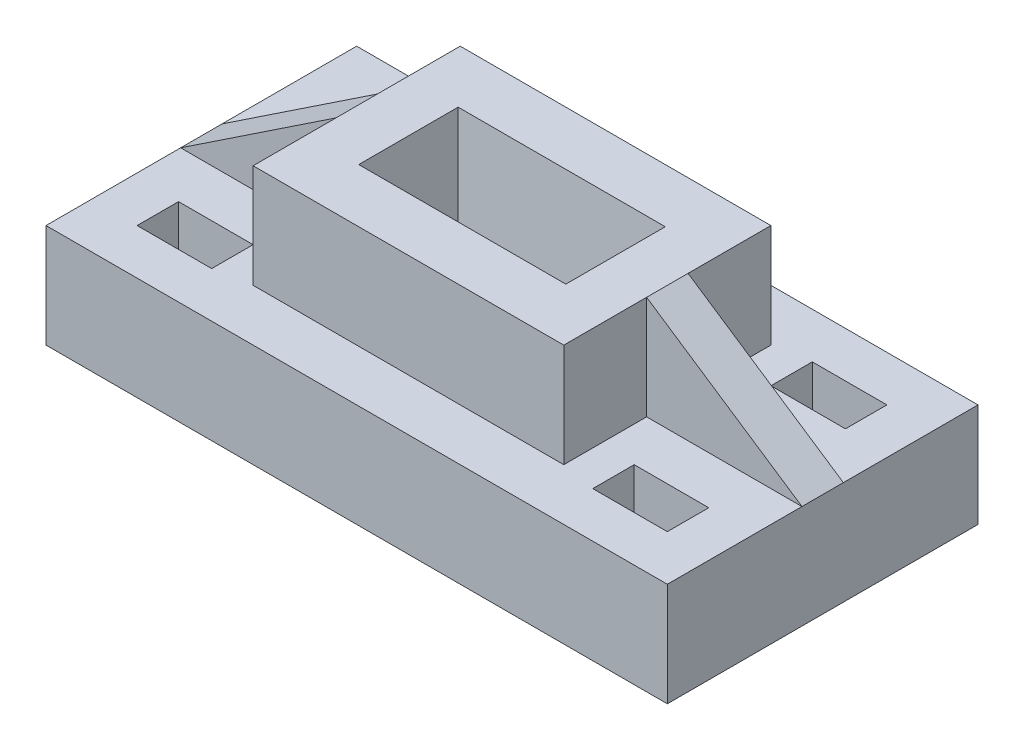
ISO-10303-21;
HEADER;
FILE_DESCRIPTION(('STEP AP214'),'2;1');
FILE_NAME('part.step','',(''),(''),'','','');
FILE_SCHEMA(('AUTOMOTIVE_DESIGN { 1 0 10303 214 1 1 1 1 }'));
ENDSEC;
DATA;
#1=APPLICATION_CONTEXT('core data for automotive mechanical design processes');
#2=APPLICATION_PROTOCOL_DEFINITION('international standard','automotive_design',2000,#1);
#3=PRODUCT_CONTEXT('',#1,'mechanical');
#4=PRODUCT('Part','Part','',(#3));
#5=PRODUCT_RELATED_PRODUCT_CATEGORY('part','',(#4));
#6=PRODUCT_DEFINITION_FORMATION('','',#4);
#7=PRODUCT_DEFINITION_CONTEXT('part definition',#1,'design');
#8=PRODUCT_DEFINITION('design','',#6,#7);
#9=PRODUCT_DEFINITION_SHAPE('','',#8);
#10=(LENGTH_UNIT() NAMED_UNIT(*) SI_UNIT(.MILLI.,.METRE.));
#11=(NAMED_UNIT(*) PLANE_ANGLE_UNIT() SI_UNIT($,.RADIAN.));
#12=(NAMED_UNIT(*) SI_UNIT($,.STERADIAN.) SOLID_ANGLE_UNIT());
#13=UNCERTAINTY_MEASURE_WITH_UNIT(LENGTH_MEASURE(1.E-05),#10,'distance_accuracy_value','');
#14=(GEOMETRIC_REPRESENTATION_CONTEXT(3) GLOBAL_UNCERTAINTY_ASSIGNED_CONTEXT((#13)) GLOBAL_UNIT_ASSIGNED_CONTEXT((#10,
#11,#12)) REPRESENTATION_CONTEXT('',''));
#15=CARTESIAN_POINT('',(0.,0.,0.));
#16=DIRECTION('',(0.,0.,1.));
#17=DIRECTION('',(1.,0.,0.));
#18=AXIS2_PLACEMENT_3D('',#15,#16,#17);
#19=CARTESIAN_POINT('',(0.,12.5,0.));
#20=DIRECTION('',(0.,1.,0.));
#21=DIRECTION('',(0.,0.,1.));
#22=AXIS2_PLACEMENT_3D('',#19,#20,#21);
#23=PLANE('',#22);
#24=DIRECTION('',(0.,0.,1.));
#25=VECTOR('',#24,1.);
#26=CARTESIAN_POINT('',(-64.,12.5,-16.5));
#27=LINE('',#26,#25);
#28=CARTESIAN_POINT('',(-64.,12.5,-26.5));
#29=VERTEX_POINT('',#28);
#30=CARTESIAN_POINT('',(-64.,12.5,-16.5));
#31=VERTEX_POINT('',#30);
#32=EDGE_CURVE('E528',#29,#31,#27,.T.);
#33=ORIENTED_EDGE('',*,*,#32,.F.);
#34=DIRECTION('',(-1.,0.,0.));
#35=VECTOR('',#34,1.);
#36=CARTESIAN_POINT('',(-46.,12.5,-26.5));
#37=LINE('',#36,#35);
#38=CARTESIAN_POINT('',(-46.,12.5,-26.5));
#39=VERTEX_POINT('',#38);
#40=EDGE_CURVE('E543',#39,#29,#37,.T.);
#41=ORIENTED_EDGE('',*,*,#40,.F.);
#42=DIRECTION('',(0.,0.,-1.));
#43=VECTOR('',#42,1.);
#44=CARTESIAN_POINT('',(-46.,12.5,-16.5));
#45=LINE('',#44,#43);
#46=CARTESIAN_POINT('',(-46.,12.5,-16.5));
#47=VERTEX_POINT('',#46);
#48=EDGE_CURVE('E562',#47,#39,#45,.T.);
#49=ORIENTED_EDGE('',*,*,#48,.F.);
#50=DIRECTION('',(1.,0.,0.));
#51=VECTOR('',#50,1.);
#52=CARTESIAN_POINT('',(-46.,12.5,-16.5));
#53=LINE('',#52,#51);
#54=EDGE_CURVE('E558',#31,#47,#53,.T.);
#55=ORIENTED_EDGE('',*,*,#54,.F.);
#56=EDGE_LOOP('',(#33,#41,#49,#55));
#57=FACE_BOUND('',#56,.T.);
#58=DIRECTION('',(1.,0.,0.));
#59=VECTOR('',#58,1.);
#60=CARTESIAN_POINT('',(46.,12.5,-26.5));
#61=LINE('',#60,#59);
#62=CARTESIAN_POINT('',(46.,12.5,-26.5));
#63=VERTEX_POINT('',#62);
#64=CARTESIAN_POINT('',(64.,12.5,-26.5));
#65=VERTEX_POINT('',#64);
#66=EDGE_CURVE('E513',#63,#65,#61,.T.);
#67=ORIENTED_EDGE('',*,*,#66,.T.);
#68=DIRECTION('',(0.,0.,1.));
#69=VECTOR('',#68,1.);
#70=CARTESIAN_POINT('',(64.,12.5,-16.5));
#71=LINE('',#70,#69);
#72=CARTESIAN_POINT('',(64.,12.5,-16.5));
#73=VERTEX_POINT('',#72);
#74=EDGE_CURVE('E368',#65,#73,#71,.T.);
#75=ORIENTED_EDGE('',*,*,#74,.T.);
#76=DIRECTION('',(-1.,0.,0.));
#77=VECTOR('',#76,1.);
#78=CARTESIAN_POINT('',(46.,12.5,-16.5));
#79=LINE('',#78,#77);
#80=CARTESIAN_POINT('',(46.,12.5,-16.5));
#81=VERTEX_POINT('',#80);
#82=EDGE_CURVE('E499',#73,#81,#79,.T.);
#83=ORIENTED_EDGE('',*,*,#82,.T.);
#84=DIRECTION('',(0.,0.,-1.));
#85=VECTOR('',#84,1.);
#86=CARTESIAN_POINT('',(46.,12.5,-16.5));
#87=LINE('',#86,#85);
#88=EDGE_CURVE('E517',#81,#63,#87,.T.);
#89=ORIENTED_EDGE('',*,*,#88,.T.);
#90=EDGE_LOOP('',(#67,#75,#83,#89));
#91=FACE_BOUND('',#90,.T.);
#92=DIRECTION('',(0.,0.,-1.));
#93=VECTOR('',#92,1.);
#94=CARTESIAN_POINT('',(37.5,12.5,-25.));
#95=LINE('',#94,#93);
#96=CARTESIAN_POINT('',(37.5,12.5,-5.));
#97=VERTEX_POINT('',#96);
#98=CARTESIAN_POINT('',(37.5,12.5,-25.));
#99=VERTEX_POINT('',#98);
#100=EDGE_CURVE('E292',#97,#99,#95,.T.);
#101=ORIENTED_EDGE('',*,*,#100,.F.);
#102=DIRECTION('',(1.,0.,0.));
#103=VECTOR('',#102,1.);
#104=CARTESIAN_POINT('',(0.,12.5,-5.));
#105=LINE('',#104,#103);
#106=CARTESIAN_POINT('',(75.,12.5,-5.));
#107=VERTEX_POINT('',#106);
#108=EDGE_CURVE('E281',#97,#107,#105,.T.);
#109=ORIENTED_EDGE('',*,*,#108,.T.);
#110=DIRECTION('',(0.,0.,-1.));
#111=VECTOR('',#110,1.);
#112=CARTESIAN_POINT('',(75.,12.5,-37.5));
#113=LINE('',#112,#111);
#114=CARTESIAN_POINT('',(75.,12.5,-37.5));
#115=VERTEX_POINT('',#114);
#116=EDGE_CURVE('E289',#107,#115,#113,.T.);
#117=ORIENTED_EDGE('',*,*,#116,.T.);
#118=DIRECTION('',(-1.,0.,0.));
#119=VECTOR('',#118,1.);
#120=CARTESIAN_POINT('',(-75.,12.5,-37.5));
#121=LINE('',#120,#119);
#122=CARTESIAN_POINT('',(-75.,12.5,-37.5));
#123=VERTEX_POINT('',#122);
#124=EDGE_CURVE('E303',#115,#123,#121,.T.);
#125=ORIENTED_EDGE('',*,*,#124,.T.);
#126=DIRECTION('',(0.,0.,1.));
#127=VECTOR('',#126,1.);
#128=CARTESIAN_POINT('',(-75.,12.5,-37.5));
#129=LINE('',#128,#127);
#130=CARTESIAN_POINT('',(-75.,12.5,-5.));
#131=VERTEX_POINT('',#130);
#132=EDGE_CURVE('E313',#123,#131,#129,.T.);
#133=ORIENTED_EDGE('',*,*,#132,.T.);
#134=DIRECTION('',(1.,0.,0.));
#135=VECTOR('',#134,1.);
#136=CARTESIAN_POINT('',(0.,12.5,-5.));
#137=LINE('',#136,#135);
#138=CARTESIAN_POINT('',(-37.5,12.5,-5.));
#139=VERTEX_POINT('',#138);
#140=EDGE_CURVE('E371',#131,#139,#137,.T.);
#141=ORIENTED_EDGE('',*,*,#140,.T.);
#142=DIRECTION('',(0.,0.,1.));
#143=VECTOR('',#142,1.);
#144=CARTESIAN_POINT('',(-37.5,12.5,-25.));
#145=LINE('',#144,#143);
#146=CARTESIAN_POINT('',(-37.5,12.5,-25.));
#147=VERTEX_POINT('',#146);
#148=EDGE_CURVE('E458',#147,#139,#145,.T.);
#149=ORIENTED_EDGE('',*,*,#148,.F.);
#150=DIRECTION('',(-1.,0.,0.));
#151=VECTOR('',#150,1.);
#152=CARTESIAN_POINT('',(-37.5,12.5,-25.));
#153=LINE('',#152,#151);
#154=EDGE_CURVE('E453',#99,#147,#153,.T.);
#155=ORIENTED_EDGE('',*,*,#154,.F.);
#156=EDGE_LOOP('',(#101,#109,#117,#125,#133,#141,#149,#155));
#157=FACE_BOUND('',#156,.T.);
#158=ADVANCED_FACE('F45',(#57,#91,#157),#23,.T.);
#159=CARTESIAN_POINT('',(37.5,37.5,-25.));
#160=DIRECTION('',(-1.,0.,0.));
#161=DIRECTION('',(0.,0.,1.));
#162=AXIS2_PLACEMENT_3D('',#159,#160,#161);
#163=PLANE('',#162);
#164=DIRECTION('',(0.,1.,0.));
#165=VECTOR('',#164,1.);
#166=CARTESIAN_POINT('',(37.5,37.5,-5.));
#167=LINE('',#166,#165);
#168=CARTESIAN_POINT('',(37.5,37.5,-5.));
#169=VERTEX_POINT('',#168);
#170=EDGE_CURVE('E283',#97,#169,#167,.T.);
#171=ORIENTED_EDGE('',*,*,#170,.F.);
#172=ORIENTED_EDGE('',*,*,#100,.T.);
#173=DIRECTION('',(0.,-1.,0.));
#174=VECTOR('',#173,1.);
#175=CARTESIAN_POINT('',(37.5,37.5,-25.));
#176=LINE('',#175,#174);
#177=CARTESIAN_POINT('',(37.5,37.5,-25.));
#178=VERTEX_POINT('',#177);
#179=EDGE_CURVE('E308',#178,#99,#176,.T.);
#180=ORIENTED_EDGE('',*,*,#179,.F.);
#181=DIRECTION('',(0.,0.,-1.));
#182=VECTOR('',#181,1.);
#183=CARTESIAN_POINT('',(37.5,37.5,-25.));
#184=LINE('',#183,#182);
#185=EDGE_CURVE('E465',#169,#178,#184,.T.);
#186=ORIENTED_EDGE('',*,*,#185,.F.);
#187=EDGE_LOOP('',(#171,#172,#180,#186));
#188=FACE_BOUND('',#187,.T.);
#189=ADVANCED_FACE('F382',(#188),#163,.F.);
#190=CARTESIAN_POINT('',(-37.5,37.5,-25.));
#191=DIRECTION('',(1.,0.,0.));
#192=DIRECTION('',(0.,0.,-1.));
#193=AXIS2_PLACEMENT_3D('',#190,#191,#192);
#194=PLANE('',#193);
#195=DIRECTION('',(0.,-1.,0.));
#196=VECTOR('',#195,1.);
#197=CARTESIAN_POINT('',(-37.5,37.5,-5.));
#198=LINE('',#197,#196);
#199=CARTESIAN_POINT('',(-37.5,37.5,-5.));
#200=VERTEX_POINT('',#199);
#201=EDGE_CURVE('E481',#200,#139,#198,.T.);
#202=ORIENTED_EDGE('',*,*,#201,.F.);
#203=DIRECTION('',(0.,0.,1.));
#204=VECTOR('',#203,1.);
#205=CARTESIAN_POINT('',(-37.5,37.5,-25.));
#206=LINE('',#205,#204);
#207=CARTESIAN_POINT('',(-37.5,37.5,-25.));
#208=VERTEX_POINT('',#207);
#209=EDGE_CURVE('E437',#208,#200,#206,.T.);
#210=ORIENTED_EDGE('',*,*,#209,.F.);
#211=DIRECTION('',(0.,-1.,0.));
#212=VECTOR('',#211,1.);
#213=CARTESIAN_POINT('',(-37.5,37.5,-25.));
#214=LINE('',#213,#212);
#215=EDGE_CURVE('E470',#208,#147,#214,.T.);
#216=ORIENTED_EDGE('',*,*,#215,.T.);
#217=ORIENTED_EDGE('',*,*,#148,.T.);
#218=EDGE_LOOP('',(#202,#210,#216,#217));
#219=FACE_BOUND('',#218,.T.);
#220=ADVANCED_FACE('F389',(#219),#194,.F.);
#221=DIRECTION('',(1.,0.,0.));
#222=VECTOR('',#221,1.);
#223=CARTESIAN_POINT('',(0.,12.5,5.));
#224=LINE('',#223,#222);
#225=CARTESIAN_POINT('',(37.5,12.5,5.));
#226=VERTEX_POINT('',#225);
#227=CARTESIAN_POINT('',(75.,12.5,5.));
#228=VERTEX_POINT('',#227);
#229=EDGE_CURVE('E294',#226,#228,#224,.T.);
#230=ORIENTED_EDGE('',*,*,#229,.F.);
#231=CARTESIAN_POINT('',(37.5,12.5,25.));
#232=VERTEX_POINT('',#231);
#233=EDGE_CURVE('E450',#232,#226,#95,.T.);
#234=ORIENTED_EDGE('',*,*,#233,.F.);
#235=DIRECTION('',(1.,0.,0.));
#236=VECTOR('',#235,1.);
#237=CARTESIAN_POINT('',(-37.5,12.5,25.));
#238=LINE('',#237,#236);
#239=CARTESIAN_POINT('',(-37.5,12.5,25.));
#240=VERTEX_POINT('',#239);
#241=EDGE_CURVE('E461',#240,#232,#238,.T.);
#242=ORIENTED_EDGE('',*,*,#241,.F.);
#243=CARTESIAN_POINT('',(-37.5,12.5,5.));
#244=VERTEX_POINT('',#243);
#245=EDGE_CURVE('E457',#244,#240,#145,.T.);
#246=ORIENTED_EDGE('',*,*,#245,.F.);
#247=DIRECTION('',(1.,0.,0.));
#248=VECTOR('',#247,1.);
#249=CARTESIAN_POINT('',(0.,12.5,5.));
#250=LINE('',#249,#248);
#251=CARTESIAN_POINT('',(-75.,12.5,5.));
#252=VERTEX_POINT('',#251);
#253=EDGE_CURVE('E363',#252,#244,#250,.T.);
#254=ORIENTED_EDGE('',*,*,#253,.F.);
#255=CARTESIAN_POINT('',(-75.,12.5,37.5));
#256=VERTEX_POINT('',#255);
#257=EDGE_CURVE('E312',#252,#256,#129,.T.);
#258=ORIENTED_EDGE('',*,*,#257,.T.);
#259=DIRECTION('',(1.,0.,0.));
#260=VECTOR('',#259,1.);
#261=CARTESIAN_POINT('',(-75.,12.5,37.5));
#262=LINE('',#261,#260);
#263=CARTESIAN_POINT('',(75.,12.5,37.5));
#264=VERTEX_POINT('',#263);
#265=EDGE_CURVE('E317',#256,#264,#262,.T.);
#266=ORIENTED_EDGE('',*,*,#265,.T.);
#267=EDGE_CURVE('E298',#264,#228,#113,.T.);
#268=ORIENTED_EDGE('',*,*,#267,.T.);
#269=EDGE_LOOP('',(#230,#234,#242,#246,#254,#258,#266,#268));
#270=FACE_BOUND('',#269,.T.);
#271=DIRECTION('',(0.,0.,-1.));
#272=VECTOR('',#271,1.);
#273=CARTESIAN_POINT('',(64.,12.5,16.5));
#274=LINE('',#273,#272);
#275=CARTESIAN_POINT('',(64.,12.5,26.5));
#276=VERTEX_POINT('',#275);
#277=CARTESIAN_POINT('',(64.,12.5,16.5));
#278=VERTEX_POINT('',#277);
#279=EDGE_CURVE('E615',#276,#278,#274,.T.);
#280=ORIENTED_EDGE('',*,*,#279,.F.);
#281=DIRECTION('',(1.,0.,0.));
#282=VECTOR('',#281,1.);
#283=CARTESIAN_POINT('',(46.,12.5,26.5));
#284=LINE('',#283,#282);
#285=CARTESIAN_POINT('',(46.,12.5,26.5));
#286=VERTEX_POINT('',#285);
#287=EDGE_CURVE('E630',#286,#276,#284,.T.);
#288=ORIENTED_EDGE('',*,*,#287,.F.);
#289=DIRECTION('',(0.,0.,1.));
#290=VECTOR('',#289,1.);
#291=CARTESIAN_POINT('',(46.,12.5,16.5));
#292=LINE('',#291,#290);
#293=CARTESIAN_POINT('',(46.,12.5,16.5));
#294=VERTEX_POINT('',#293);
#295=EDGE_CURVE('E649',#294,#286,#292,.T.);
#296=ORIENTED_EDGE('',*,*,#295,.F.);
#297=DIRECTION('',(-1.,0.,0.));
#298=VECTOR('',#297,1.);
#299=CARTESIAN_POINT('',(46.,12.5,16.5));
#300=LINE('',#299,#298);
#301=EDGE_CURVE('E645',#278,#294,#300,.T.);
#302=ORIENTED_EDGE('',*,*,#301,.F.);
#303=EDGE_LOOP('',(#280,#288,#296,#302));
#304=FACE_BOUND('',#303,.T.);
#305=DIRECTION('',(-1.,0.,0.));
#306=VECTOR('',#305,1.);
#307=CARTESIAN_POINT('',(-46.,12.5,26.5));
#308=LINE('',#307,#306);
#309=CARTESIAN_POINT('',(-46.,12.5,26.5));
#310=VERTEX_POINT('',#309);
#311=CARTESIAN_POINT('',(-64.,12.5,26.5));
#312=VERTEX_POINT('',#311);
#313=EDGE_CURVE('E600',#310,#312,#308,.T.);
#314=ORIENTED_EDGE('',*,*,#313,.T.);
#315=DIRECTION('',(0.,0.,-1.));
#316=VECTOR('',#315,1.);
#317=CARTESIAN_POINT('',(-64.,12.5,16.5));
#318=LINE('',#317,#316);
#319=CARTESIAN_POINT('',(-64.,12.5,16.5));
#320=VERTEX_POINT('',#319);
#321=EDGE_CURVE('E572',#312,#320,#318,.T.);
#322=ORIENTED_EDGE('',*,*,#321,.T.);
#323=DIRECTION('',(1.,0.,0.));
#324=VECTOR('',#323,1.);
#325=CARTESIAN_POINT('',(-46.,12.5,16.5));
#326=LINE('',#325,#324);
#327=CARTESIAN_POINT('',(-46.,12.5,16.5));
#328=VERTEX_POINT('',#327);
#329=EDGE_CURVE('E586',#320,#328,#326,.T.);
#330=ORIENTED_EDGE('',*,*,#329,.T.);
#331=DIRECTION('',(0.,0.,1.));
#332=VECTOR('',#331,1.);
#333=CARTESIAN_POINT('',(-46.,12.5,16.5));
#334=LINE('',#333,#332);
#335=EDGE_CURVE('E604',#328,#310,#334,.T.);
#336=ORIENTED_EDGE('',*,*,#335,.T.);
#337=EDGE_LOOP('',(#314,#322,#330,#336));
#338=FACE_BOUND('',#337,.T.);
#339=ADVANCED_FACE('F358',(#270,#304,#338),#23,.T.);
#340=CARTESIAN_POINT('',(0.,-12.5,0.));
#341=DIRECTION('',(0.,1.,0.));
#342=DIRECTION('',(0.,0.,1.));
#343=AXIS2_PLACEMENT_3D('',#340,#341,#342);
#344=PLANE('',#343);
#345=DIRECTION('',(0.,0.,-1.));
#346=VECTOR('',#345,1.);
#347=CARTESIAN_POINT('',(-64.,-12.5,16.5));
#348=LINE('',#347,#346);
#349=CARTESIAN_POINT('',(-64.,-12.5,26.5));
#350=VERTEX_POINT('',#349);
#351=CARTESIAN_POINT('',(-64.,-12.5,16.5));
#352=VERTEX_POINT('',#351);
#353=EDGE_CURVE('E582',#350,#352,#348,.T.);
#354=ORIENTED_EDGE('',*,*,#353,.F.);
#355=DIRECTION('',(-1.,0.,0.));
#356=VECTOR('',#355,1.);
#357=CARTESIAN_POINT('',(-46.,-12.5,26.5));
#358=LINE('',#357,#356);
#359=CARTESIAN_POINT('',(-46.,-12.5,26.5));
#360=VERTEX_POINT('',#359);
#361=EDGE_CURVE('E585',#360,#350,#358,.T.);
#362=ORIENTED_EDGE('',*,*,#361,.F.);
#363=DIRECTION('',(0.,0.,1.));
#364=VECTOR('',#363,1.);
#365=CARTESIAN_POINT('',(-46.,-12.5,16.5));
#366=LINE('',#365,#364);
#367=CARTESIAN_POINT('',(-46.,-12.5,16.5));
#368=VERTEX_POINT('',#367);
#369=EDGE_CURVE('E589',#368,#360,#366,.T.);
#370=ORIENTED_EDGE('',*,*,#369,.F.);
#371=DIRECTION('',(1.,0.,0.));
#372=VECTOR('',#371,1.);
#373=CARTESIAN_POINT('',(-46.,-12.5,16.5));
#374=LINE('',#373,#372);
#375=EDGE_CURVE('E593',#352,#368,#374,.T.);
#376=ORIENTED_EDGE('',*,*,#375,.F.);
#377=EDGE_LOOP('',(#354,#362,#370,#376));
#378=FACE_BOUND('',#377,.T.);
#379=DIRECTION('',(1.,0.,0.));
#380=VECTOR('',#379,1.);
#381=CARTESIAN_POINT('',(46.,-12.5,26.5));
#382=LINE('',#381,#380);
#383=CARTESIAN_POINT('',(46.,-12.5,26.5));
#384=VERTEX_POINT('',#383);
#385=CARTESIAN_POINT('',(64.,-12.5,26.5));
#386=VERTEX_POINT('',#385);
#387=EDGE_CURVE('E638',#384,#386,#382,.T.);
#388=ORIENTED_EDGE('',*,*,#387,.T.);
#389=DIRECTION('',(0.,0.,-1.));
#390=VECTOR('',#389,1.);
#391=CARTESIAN_POINT('',(64.,-12.5,16.5));
#392=LINE('',#391,#390);
#393=CARTESIAN_POINT('',(64.,-12.5,16.5));
#394=VERTEX_POINT('',#393);
#395=EDGE_CURVE('E625',#386,#394,#392,.T.);
#396=ORIENTED_EDGE('',*,*,#395,.T.);
#397=DIRECTION('',(-1.,0.,0.));
#398=VECTOR('',#397,1.);
#399=CARTESIAN_POINT('',(46.,-12.5,16.5));
#400=LINE('',#399,#398);
#401=CARTESIAN_POINT('',(46.,-12.5,16.5));
#402=VERTEX_POINT('',#401);
#403=EDGE_CURVE('E629',#394,#402,#400,.T.);
#404=ORIENTED_EDGE('',*,*,#403,.T.);
#405=DIRECTION('',(0.,0.,1.));
#406=VECTOR('',#405,1.);
#407=CARTESIAN_POINT('',(46.,-12.5,16.5));
#408=LINE('',#407,#406);
#409=EDGE_CURVE('E634',#402,#384,#408,.T.);
#410=ORIENTED_EDGE('',*,*,#409,.T.);
#411=EDGE_LOOP('',(#388,#396,#404,#410));
#412=FACE_BOUND('',#411,.T.);
#413=DIRECTION('',(1.,0.,0.));
#414=VECTOR('',#413,1.);
#415=CARTESIAN_POINT('',(-75.,-12.5,37.5));
#416=LINE('',#415,#414);
#417=CARTESIAN_POINT('',(-75.,-12.5,37.5));
#418=VERTEX_POINT('',#417);
#419=CARTESIAN_POINT('',(75.,-12.5,37.5));
#420=VERTEX_POINT('',#419);
#421=EDGE_CURVE('E299',#418,#420,#416,.T.);
#422=ORIENTED_EDGE('',*,*,#421,.F.);
#423=DIRECTION('',(0.,0.,1.));
#424=VECTOR('',#423,1.);
#425=CARTESIAN_POINT('',(-75.,-12.5,-37.5));
#426=LINE('',#425,#424);
#427=CARTESIAN_POINT('',(-75.,-12.5,-37.5));
#428=VERTEX_POINT('',#427);
#429=EDGE_CURVE('E304',#428,#418,#426,.T.);
#430=ORIENTED_EDGE('',*,*,#429,.F.);
#431=DIRECTION('',(-1.,0.,0.));
#432=VECTOR('',#431,1.);
#433=CARTESIAN_POINT('',(-75.,-12.5,-37.5));
#434=LINE('',#433,#432);
#435=CARTESIAN_POINT('',(75.,-12.5,-37.5));
#436=VERTEX_POINT('',#435);
#437=EDGE_CURVE('E324',#436,#428,#434,.T.);
#438=ORIENTED_EDGE('',*,*,#437,.F.);
#439=DIRECTION('',(0.,0.,-1.));
#440=VECTOR('',#439,1.);
#441=CARTESIAN_POINT('',(75.,-12.5,-37.5));
#442=LINE('',#441,#440);
#443=EDGE_CURVE('E321',#420,#436,#442,.T.);
#444=ORIENTED_EDGE('',*,*,#443,.F.);
#445=EDGE_LOOP('',(#422,#430,#438,#444));
#446=FACE_BOUND('',#445,.T.);
#447=DIRECTION('',(-1.,0.,0.));
#448=VECTOR('',#447,1.);
#449=CARTESIAN_POINT('',(-46.,-12.5,-26.5));
#450=LINE('',#449,#448);
#451=CARTESIAN_POINT('',(-46.,-12.5,-26.5));
#452=VERTEX_POINT('',#451);
#453=CARTESIAN_POINT('',(-64.,-12.5,-26.5));
#454=VERTEX_POINT('',#453);
#455=EDGE_CURVE('E551',#452,#454,#450,.T.);
#456=ORIENTED_EDGE('',*,*,#455,.T.);
#457=DIRECTION('',(0.,0.,1.));
#458=VECTOR('',#457,1.);
#459=CARTESIAN_POINT('',(-64.,-12.5,-16.5));
#460=LINE('',#459,#458);
#461=CARTESIAN_POINT('',(-64.,-12.5,-16.5));
#462=VERTEX_POINT('',#461);
#463=EDGE_CURVE('E538',#454,#462,#460,.T.);
#464=ORIENTED_EDGE('',*,*,#463,.T.);
#465=DIRECTION('',(1.,0.,0.));
#466=VECTOR('',#465,1.);
#467=CARTESIAN_POINT('',(-46.,-12.5,-16.5));
#468=LINE('',#467,#466);
#469=CARTESIAN_POINT('',(-46.,-12.5,-16.5));
#470=VERTEX_POINT('',#469);
#471=EDGE_CURVE('E542',#462,#470,#468,.T.);
#472=ORIENTED_EDGE('',*,*,#471,.T.);
#473=DIRECTION('',(0.,0.,-1.));
#474=VECTOR('',#473,1.);
#475=CARTESIAN_POINT('',(-46.,-12.5,-16.5));
#476=LINE('',#475,#474);
#477=EDGE_CURVE('E547',#470,#452,#476,.T.);
#478=ORIENTED_EDGE('',*,*,#477,.T.);
#479=EDGE_LOOP('',(#456,#464,#472,#478));
#480=FACE_BOUND('',#479,.T.);
#481=DIRECTION('',(0.,0.,1.));
#482=VECTOR('',#481,1.);
#483=CARTESIAN_POINT('',(64.,-12.5,-16.5));
#484=LINE('',#483,#482);
#485=CARTESIAN_POINT('',(64.,-12.5,-26.5));
#486=VERTEX_POINT('',#485);
#487=CARTESIAN_POINT('',(64.,-12.5,-16.5));
#488=VERTEX_POINT('',#487);
#489=EDGE_CURVE('E495',#486,#488,#484,.T.);
#490=ORIENTED_EDGE('',*,*,#489,.F.);
#491=DIRECTION('',(1.,0.,0.));
#492=VECTOR('',#491,1.);
#493=CARTESIAN_POINT('',(46.,-12.5,-26.5));
#494=LINE('',#493,#492);
#495=CARTESIAN_POINT('',(46.,-12.5,-26.5));
#496=VERTEX_POINT('',#495);
#497=EDGE_CURVE('E498',#496,#486,#494,.T.);
#498=ORIENTED_EDGE('',*,*,#497,.F.);
#499=DIRECTION('',(0.,0.,-1.));
#500=VECTOR('',#499,1.);
#501=CARTESIAN_POINT('',(46.,-12.5,-16.5));
#502=LINE('',#501,#500);
#503=CARTESIAN_POINT('',(46.,-12.5,-16.5));
#504=VERTEX_POINT('',#503);
#505=EDGE_CURVE('E502',#504,#496,#502,.T.);
#506=ORIENTED_EDGE('',*,*,#505,.F.);
#507=DIRECTION('',(-1.,0.,0.));
#508=VECTOR('',#507,1.);
#509=CARTESIAN_POINT('',(46.,-12.5,-16.5));
#510=LINE('',#509,#508);
#511=EDGE_CURVE('E506',#488,#504,#510,.T.);
#512=ORIENTED_EDGE('',*,*,#511,.F.);
#513=EDGE_LOOP('',(#490,#498,#506,#512));
#514=FACE_BOUND('',#513,.T.);
#515=ADVANCED_FACE('F349',(#378,#412,#446,#480,#514),#344,.F.);
#516=CARTESIAN_POINT('',(75.,12.5,-37.5));
#517=DIRECTION('',(-1.,0.,0.));
#518=DIRECTION('',(0.,0.,1.));
#519=AXIS2_PLACEMENT_3D('',#516,#517,#518);
#520=PLANE('',#519);
#521=ORIENTED_EDGE('',*,*,#443,.T.);
#522=DIRECTION('',(0.,-1.,0.));
#523=VECTOR('',#522,1.);
#524=CARTESIAN_POINT('',(75.,12.5,-37.5));
#525=LINE('',#524,#523);
#526=EDGE_CURVE('E11',#115,#436,#525,.T.);
#527=ORIENTED_EDGE('',*,*,#526,.F.);
#528=ORIENTED_EDGE('',*,*,#116,.F.);
#529=DIRECTION('',(0.,0.,-1.));
#530=VECTOR('',#529,1.);
#531=CARTESIAN_POINT('',(75.,12.5,-37.5));
#532=LINE('',#531,#530);
#533=EDGE_CURVE('E266',#228,#107,#532,.T.);
#534=ORIENTED_EDGE('',*,*,#533,.F.);
#535=ORIENTED_EDGE('',*,*,#267,.F.);
#536=DIRECTION('',(0.,-1.,0.));
#537=VECTOR('',#536,1.);
#538=CARTESIAN_POINT('',(75.,12.5,37.5));
#539=LINE('',#538,#537);
#540=EDGE_CURVE('E320',#264,#420,#539,.T.);
#541=ORIENTED_EDGE('',*,*,#540,.T.);
#542=EDGE_LOOP('',(#521,#527,#528,#534,#535,#541));
#543=FACE_BOUND('',#542,.T.);
#544=ADVANCED_FACE('F47',(#543),#520,.F.);
#545=CARTESIAN_POINT('',(-75.,12.5,-37.5));
#546=DIRECTION('',(0.,0.,1.));
#547=DIRECTION('',(1.,0.,0.));
#548=AXIS2_PLACEMENT_3D('',#545,#546,#547);
#549=PLANE('',#548);
#550=ORIENTED_EDGE('',*,*,#437,.T.);
#551=DIRECTION('',(0.,-1.,0.));
#552=VECTOR('',#551,1.);
#553=CARTESIAN_POINT('',(-75.,12.5,-37.5));
#554=LINE('',#553,#552);
#555=EDGE_CURVE('E54',#123,#428,#554,.T.);
#556=ORIENTED_EDGE('',*,*,#555,.F.);
#557=ORIENTED_EDGE('',*,*,#124,.F.);
#558=ORIENTED_EDGE('',*,*,#526,.T.);
#559=EDGE_LOOP('',(#550,#556,#557,#558));
#560=FACE_BOUND('',#559,.T.);
#561=ADVANCED_FACE('F373',(#560),#549,.F.);
#562=CARTESIAN_POINT('',(-75.,12.5,-37.5));
#563=DIRECTION('',(1.,0.,0.));
#564=DIRECTION('',(0.,0.,-1.));
#565=AXIS2_PLACEMENT_3D('',#562,#563,#564);
#566=PLANE('',#565);
#567=ORIENTED_EDGE('',*,*,#257,.F.);
#568=DIRECTION('',(0.,0.,-1.));
#569=VECTOR('',#568,1.);
#570=CARTESIAN_POINT('',(-75.,12.5,-37.5));
#571=LINE('',#570,#569);
#572=EDGE_CURVE('E365',#131,#252,#571,.F.);
#573=ORIENTED_EDGE('',*,*,#572,.F.);
#574=ORIENTED_EDGE('',*,*,#132,.F.);
#575=ORIENTED_EDGE('',*,*,#555,.T.);
#576=ORIENTED_EDGE('',*,*,#429,.T.);
#577=DIRECTION('',(0.,-1.,0.));
#578=VECTOR('',#577,1.);
#579=CARTESIAN_POINT('',(-75.,12.5,37.5));
#580=LINE('',#579,#578);
#581=EDGE_CURVE('E332',#256,#418,#580,.T.);
#582=ORIENTED_EDGE('',*,*,#581,.F.);
#583=EDGE_LOOP('',(#567,#573,#574,#575,#576,#582));
#584=FACE_BOUND('',#583,.T.);
#585=ADVANCED_FACE('F342',(#584),#566,.F.);
#586=CARTESIAN_POINT('',(-75.,12.5,37.5));
#587=DIRECTION('',(0.,0.,-1.));
#588=DIRECTION('',(-1.,0.,0.));
#589=AXIS2_PLACEMENT_3D('',#586,#587,#588);
#590=PLANE('',#589);
#591=ORIENTED_EDGE('',*,*,#421,.T.);
#592=ORIENTED_EDGE('',*,*,#540,.F.);
#593=ORIENTED_EDGE('',*,*,#265,.F.);
#594=ORIENTED_EDGE('',*,*,#581,.T.);
#595=EDGE_LOOP('',(#591,#592,#593,#594));
#596=FACE_BOUND('',#595,.T.);
#597=ADVANCED_FACE('F354',(#596),#590,.F.);
#598=ORIENTED_EDGE('',*,*,#233,.T.);
#599=DIRECTION('',(0.,1.,0.));
#600=VECTOR('',#599,1.);
#601=CARTESIAN_POINT('',(37.5,37.5,5.));
#602=LINE('',#601,#600);
#603=CARTESIAN_POINT('',(37.5,37.5,5.));
#604=VERTEX_POINT('',#603);
#605=EDGE_CURVE('E276',#226,#604,#602,.T.);
#606=ORIENTED_EDGE('',*,*,#605,.T.);
#607=CARTESIAN_POINT('',(37.5,37.5,25.));
#608=VERTEX_POINT('',#607);
#609=EDGE_CURVE('E708',#608,#604,#184,.T.);
#610=ORIENTED_EDGE('',*,*,#609,.F.);
#611=DIRECTION('',(0.,-1.,0.));
#612=VECTOR('',#611,1.);
#613=CARTESIAN_POINT('',(37.5,37.5,25.));
#614=LINE('',#613,#612);
#615=EDGE_CURVE('E449',#608,#232,#614,.T.);
#616=ORIENTED_EDGE('',*,*,#615,.T.);
#617=EDGE_LOOP('',(#598,#606,#610,#616));
#618=FACE_BOUND('',#617,.T.);
#619=ADVANCED_FACE('F392',(#618),#163,.F.);
#620=CARTESIAN_POINT('',(-37.5,37.5,-25.));
#621=DIRECTION('',(0.,0.,1.));
#622=DIRECTION('',(1.,0.,0.));
#623=AXIS2_PLACEMENT_3D('',#620,#621,#622);
#624=PLANE('',#623);
#625=ORIENTED_EDGE('',*,*,#154,.T.);
#626=ORIENTED_EDGE('',*,*,#215,.F.);
#627=DIRECTION('',(-1.,0.,0.));
#628=VECTOR('',#627,1.);
#629=CARTESIAN_POINT('',(-37.5,37.5,-25.));
#630=LINE('',#629,#628);
#631=EDGE_CURVE('E435',#178,#208,#630,.T.);
#632=ORIENTED_EDGE('',*,*,#631,.F.);
#633=ORIENTED_EDGE('',*,*,#179,.T.);
#634=EDGE_LOOP('',(#625,#626,#632,#633));
#635=FACE_BOUND('',#634,.T.);
#636=ADVANCED_FACE('F413',(#635),#624,.F.);
#637=CARTESIAN_POINT('',(-37.5,37.5,5.));
#638=VERTEX_POINT('',#637);
#639=CARTESIAN_POINT('',(-37.5,37.5,25.));
#640=VERTEX_POINT('',#639);
#641=EDGE_CURVE('E426',#638,#640,#206,.T.);
#642=ORIENTED_EDGE('',*,*,#641,.F.);
#643=DIRECTION('',(0.,-1.,0.));
#644=VECTOR('',#643,1.);
#645=CARTESIAN_POINT('',(-37.5,37.5,5.));
#646=LINE('',#645,#644);
#647=EDGE_CURVE('E428',#638,#244,#646,.T.);
#648=ORIENTED_EDGE('',*,*,#647,.T.);
#649=ORIENTED_EDGE('',*,*,#245,.T.);
#650=DIRECTION('',(0.,-1.,0.));
#651=VECTOR('',#650,1.);
#652=CARTESIAN_POINT('',(-37.5,37.5,25.));
#653=LINE('',#652,#651);
#654=EDGE_CURVE('E430',#640,#240,#653,.T.);
#655=ORIENTED_EDGE('',*,*,#654,.F.);
#656=EDGE_LOOP('',(#642,#648,#649,#655));
#657=FACE_BOUND('',#656,.T.);
#658=ADVANCED_FACE('F404',(#657),#194,.F.);
#659=CARTESIAN_POINT('',(-37.5,37.5,25.));
#660=DIRECTION('',(0.,0.,-1.));
#661=DIRECTION('',(-1.,0.,0.));
#662=AXIS2_PLACEMENT_3D('',#659,#660,#661);
#663=PLANE('',#662);
#664=ORIENTED_EDGE('',*,*,#241,.T.);
#665=ORIENTED_EDGE('',*,*,#615,.F.);
#666=DIRECTION('',(1.,0.,0.));
#667=VECTOR('',#666,1.);
#668=CARTESIAN_POINT('',(-37.5,37.5,25.));
#669=LINE('',#668,#667);
#670=EDGE_CURVE('E443',#640,#608,#669,.T.);
#671=ORIENTED_EDGE('',*,*,#670,.F.);
#672=ORIENTED_EDGE('',*,*,#654,.T.);
#673=EDGE_LOOP('',(#664,#665,#671,#672));
#674=FACE_BOUND('',#673,.T.);
#675=ADVANCED_FACE('F412',(#674),#663,.F.);
#676=CARTESIAN_POINT('',(0.,37.5,0.));
#677=DIRECTION('',(0.,1.,0.));
#678=DIRECTION('',(0.,0.,1.));
#679=AXIS2_PLACEMENT_3D('',#676,#677,#678);
#680=PLANE('',#679);
#681=DIRECTION('',(1.,0.,0.));
#682=VECTOR('',#681,1.);
#683=CARTESIAN_POINT('',(-25.,37.5,12.));
#684=LINE('',#683,#682);
#685=CARTESIAN_POINT('',(-25.,37.5,12.));
#686=VERTEX_POINT('',#685);
#687=CARTESIAN_POINT('',(25.,37.5,12.));
#688=VERTEX_POINT('',#687);
#689=EDGE_CURVE('E678',#686,#688,#684,.T.);
#690=ORIENTED_EDGE('',*,*,#689,.F.);
#691=DIRECTION('',(0.,0.,1.));
#692=VECTOR('',#691,1.);
#693=CARTESIAN_POINT('',(-25.,37.5,-12.));
#694=LINE('',#693,#692);
#695=CARTESIAN_POINT('',(-25.,37.5,-12.));
#696=VERTEX_POINT('',#695);
#697=EDGE_CURVE('E675',#696,#686,#694,.T.);
#698=ORIENTED_EDGE('',*,*,#697,.F.);
#699=DIRECTION('',(-1.,0.,0.));
#700=VECTOR('',#699,1.);
#701=CARTESIAN_POINT('',(-25.,37.5,-12.));
#702=LINE('',#701,#700);
#703=CARTESIAN_POINT('',(25.,37.5,-12.));
#704=VERTEX_POINT('',#703);
#705=EDGE_CURVE('E671',#704,#696,#702,.T.);
#706=ORIENTED_EDGE('',*,*,#705,.F.);
#707=DIRECTION('',(0.,0.,-1.));
#708=VECTOR('',#707,1.);
#709=CARTESIAN_POINT('',(25.,37.5,-12.));
#710=LINE('',#709,#708);
#711=EDGE_CURVE('E659',#688,#704,#710,.T.);
#712=ORIENTED_EDGE('',*,*,#711,.F.);
#713=EDGE_LOOP('',(#690,#698,#706,#712));
#714=FACE_BOUND('',#713,.T.);
#715=EDGE_CURVE('E434',#200,#638,#206,.T.);
#716=ORIENTED_EDGE('',*,*,#715,.T.);
#717=ORIENTED_EDGE('',*,*,#641,.T.);
#718=ORIENTED_EDGE('',*,*,#670,.T.);
#719=ORIENTED_EDGE('',*,*,#609,.T.);
#720=EDGE_CURVE('E711',#604,#169,#184,.T.);
#721=ORIENTED_EDGE('',*,*,#720,.T.);
#722=ORIENTED_EDGE('',*,*,#185,.T.);
#723=ORIENTED_EDGE('',*,*,#631,.T.);
#724=ORIENTED_EDGE('',*,*,#209,.T.);
#725=EDGE_LOOP('',(#716,#717,#718,#719,#721,#722,#723,#724));
#726=FACE_BOUND('',#725,.T.);
#727=ADVANCED_FACE('F419',(#714,#726),#680,.T.);
#728=CARTESIAN_POINT('',(25.,37.5,-12.));
#729=DIRECTION('',(0.996194698091746,-0.0871557427476584,0.));
#730=DIRECTION('',(0.0871557427476584,0.996194698091746,0.));
#731=AXIS2_PLACEMENT_3D('',#728,#729,#730);
#732=PLANE('',#731);
#733=ORIENTED_EDGE('',*,*,#711,.T.);
#734=DIRECTION('',(0.0868265938642478,0.992432509138967,-0.0868265938642478));
#735=VECTOR('',#734,1.);
#736=CARTESIAN_POINT('',(25.,37.5,-12.));
#737=LINE('',#736,#735);
#738=CARTESIAN_POINT('',(22.8127834118519,12.5,-9.8127834118519));
#739=VERTEX_POINT('',#738);
#740=EDGE_CURVE('E686',#739,#704,#737,.T.);
#741=ORIENTED_EDGE('',*,*,#740,.F.);
#742=DIRECTION('',(0.,0.,-1.));
#743=VECTOR('',#742,1.);
#744=CARTESIAN_POINT('',(22.8127834118519,12.5,0.));
#745=LINE('',#744,#743);
#746=CARTESIAN_POINT('',(22.8127834118519,12.5,9.81278341185189));
#747=VERTEX_POINT('',#746);
#748=EDGE_CURVE('E682',#747,#739,#745,.T.);
#749=ORIENTED_EDGE('',*,*,#748,.F.);
#750=DIRECTION('',(0.0868265938642478,0.992432509138967,0.0868265938642478));
#751=VECTOR('',#750,1.);
#752=CARTESIAN_POINT('',(24.6230571298967,33.1915232795657,11.6230571298966));
#753=LINE('',#752,#751);
#754=EDGE_CURVE('E480',#747,#688,#753,.T.);
#755=ORIENTED_EDGE('',*,*,#754,.T.);
#756=EDGE_LOOP('',(#733,#741,#749,#755));
#757=FACE_BOUND('',#756,.T.);
#758=ADVANCED_FACE('F808',(#757),#732,.F.);
#759=CARTESIAN_POINT('',(-25.,37.5,12.));
#760=DIRECTION('',(0.,-0.0871557427476584,0.996194698091746));
#761=DIRECTION('',(0.,-0.996194698091746,-0.0871557427476584));
#762=AXIS2_PLACEMENT_3D('',#759,#760,#761);
#763=PLANE('',#762);
#764=ORIENTED_EDGE('',*,*,#689,.T.);
#765=ORIENTED_EDGE('',*,*,#754,.F.);
#766=DIRECTION('',(1.,0.,0.));
#767=VECTOR('',#766,1.);
#768=CARTESIAN_POINT('',(0.,12.5,9.81278341185189));
#769=LINE('',#768,#767);
#770=CARTESIAN_POINT('',(-22.8127834118519,12.5,9.81278341185189));
#771=VERTEX_POINT('',#770);
#772=EDGE_CURVE('E691',#771,#747,#769,.T.);
#773=ORIENTED_EDGE('',*,*,#772,.F.);
#774=DIRECTION('',(-0.0868265938642478,0.992432509138967,0.0868265938642478));
#775=VECTOR('',#774,1.);
#776=CARTESIAN_POINT('',(-24.8190674223504,35.4319311741916,11.8190674223504));
#777=LINE('',#776,#775);
#778=EDGE_CURVE('E685',#771,#686,#777,.T.);
#779=ORIENTED_EDGE('',*,*,#778,.T.);
#780=EDGE_LOOP('',(#764,#765,#773,#779));
#781=FACE_BOUND('',#780,.T.);
#782=ADVANCED_FACE('F811',(#781),#763,.F.);
#783=CARTESIAN_POINT('',(-25.,37.5,-12.));
#784=DIRECTION('',(-0.996194698091746,-0.0871557427476584,0.));
#785=DIRECTION('',(0.0871557427476584,-0.996194698091746,0.));
#786=AXIS2_PLACEMENT_3D('',#783,#784,#785);
#787=PLANE('',#786);
#788=ORIENTED_EDGE('',*,*,#778,.F.);
#789=DIRECTION('',(0.,0.,1.));
#790=VECTOR('',#789,1.);
#791=CARTESIAN_POINT('',(-22.8127834118519,12.5,0.));
#792=LINE('',#791,#790);
#793=CARTESIAN_POINT('',(-22.8127834118519,12.5,-9.8127834118519));
#794=VERTEX_POINT('',#793);
#795=EDGE_CURVE('E703',#794,#771,#792,.T.);
#796=ORIENTED_EDGE('',*,*,#795,.F.);
#797=DIRECTION('',(-0.0868265938642478,0.992432509138967,-0.0868265938642478));
#798=VECTOR('',#797,1.);
#799=CARTESIAN_POINT('',(-25.,37.5,-12.));
#800=LINE('',#799,#798);
#801=EDGE_CURVE('E690',#794,#696,#800,.T.);
#802=ORIENTED_EDGE('',*,*,#801,.T.);
#803=ORIENTED_EDGE('',*,*,#697,.T.);
#804=EDGE_LOOP('',(#788,#796,#802,#803));
#805=FACE_BOUND('',#804,.T.);
#806=ADVANCED_FACE('F815',(#805),#787,.F.);
#807=CARTESIAN_POINT('',(-25.,37.5,-12.));
#808=DIRECTION('',(0.,-0.0871557427476584,-0.996194698091746));
#809=DIRECTION('',(0.,0.996194698091746,-0.0871557427476584));
#810=AXIS2_PLACEMENT_3D('',#807,#808,#809);
#811=PLANE('',#810);
#812=ORIENTED_EDGE('',*,*,#705,.T.);
#813=ORIENTED_EDGE('',*,*,#801,.F.);
#814=DIRECTION('',(-1.,0.,0.));
#815=VECTOR('',#814,1.);
#816=CARTESIAN_POINT('',(0.,12.5,-9.8127834118519));
#817=LINE('',#816,#815);
#818=EDGE_CURVE('E699',#739,#794,#817,.T.);
#819=ORIENTED_EDGE('',*,*,#818,.F.);
#820=ORIENTED_EDGE('',*,*,#740,.T.);
#821=EDGE_LOOP('',(#812,#813,#819,#820));
#822=FACE_BOUND('',#821,.T.);
#823=ADVANCED_FACE('F806',(#822),#811,.F.);
#824=CARTESIAN_POINT('',(0.,12.5,0.));
#825=DIRECTION('',(0.,1.,0.));
#826=DIRECTION('',(0.,0.,1.));
#827=AXIS2_PLACEMENT_3D('',#824,#825,#826);
#828=PLANE('',#827);
#829=ORIENTED_EDGE('',*,*,#748,.T.);
#830=ORIENTED_EDGE('',*,*,#818,.T.);
#831=ORIENTED_EDGE('',*,*,#795,.T.);
#832=ORIENTED_EDGE('',*,*,#772,.T.);
#833=EDGE_LOOP('',(#829,#830,#831,#832));
#834=FACE_BOUND('',#833,.T.);
#835=ADVANCED_FACE('F802',(#834),#828,.T.);
#836=CARTESIAN_POINT('',(64.,-12.5,16.5));
#837=DIRECTION('',(1.,0.,0.));
#838=DIRECTION('',(0.,0.,-1.));
#839=AXIS2_PLACEMENT_3D('',#836,#837,#838);
#840=PLANE('',#839);
#841=ORIENTED_EDGE('',*,*,#279,.T.);
#842=DIRECTION('',(0.,1.,0.));
#843=VECTOR('',#842,1.);
#844=CARTESIAN_POINT('',(64.,-12.5,16.5));
#845=LINE('',#844,#843);
#846=EDGE_CURVE('E642',#394,#278,#845,.T.);
#847=ORIENTED_EDGE('',*,*,#846,.F.);
#848=ORIENTED_EDGE('',*,*,#395,.F.);
#849=DIRECTION('',(0.,1.,0.));
#850=VECTOR('',#849,1.);
#851=CARTESIAN_POINT('',(64.,-12.5,26.5));
#852=LINE('',#851,#850);
#853=EDGE_CURVE('E656',#386,#276,#852,.T.);
#854=ORIENTED_EDGE('',*,*,#853,.T.);
#855=EDGE_LOOP('',(#841,#847,#848,#854));
#856=FACE_BOUND('',#855,.T.);
#857=ADVANCED_FACE('F792',(#856),#840,.F.);
#858=CARTESIAN_POINT('',(46.,-12.5,26.5));
#859=DIRECTION('',(0.,0.,1.));
#860=DIRECTION('',(1.,0.,0.));
#861=AXIS2_PLACEMENT_3D('',#858,#859,#860);
#862=PLANE('',#861);
#863=ORIENTED_EDGE('',*,*,#287,.T.);
#864=ORIENTED_EDGE('',*,*,#853,.F.);
#865=ORIENTED_EDGE('',*,*,#387,.F.);
#866=DIRECTION('',(0.,1.,0.));
#867=VECTOR('',#866,1.);
#868=CARTESIAN_POINT('',(46.,-12.5,26.5));
#869=LINE('',#868,#867);
#870=EDGE_CURVE('E660',#384,#286,#869,.T.);
#871=ORIENTED_EDGE('',*,*,#870,.T.);
#872=EDGE_LOOP('',(#863,#864,#865,#871));
#873=FACE_BOUND('',#872,.T.);
#874=ADVANCED_FACE('F788',(#873),#862,.F.);
#875=CARTESIAN_POINT('',(46.,-12.5,16.5));
#876=DIRECTION('',(-1.,0.,0.));
#877=DIRECTION('',(0.,0.,1.));
#878=AXIS2_PLACEMENT_3D('',#875,#876,#877);
#879=PLANE('',#878);
#880=ORIENTED_EDGE('',*,*,#295,.T.);
#881=ORIENTED_EDGE('',*,*,#870,.F.);
#882=ORIENTED_EDGE('',*,*,#409,.F.);
#883=DIRECTION('',(0.,1.,0.));
#884=VECTOR('',#883,1.);
#885=CARTESIAN_POINT('',(46.,-12.5,16.5));
#886=LINE('',#885,#884);
#887=EDGE_CURVE('E663',#402,#294,#886,.T.);
#888=ORIENTED_EDGE('',*,*,#887,.T.);
#889=EDGE_LOOP('',(#880,#881,#882,#888));
#890=FACE_BOUND('',#889,.T.);
#891=ADVANCED_FACE('F791',(#890),#879,.F.);
#892=CARTESIAN_POINT('',(46.,-12.5,16.5));
#893=DIRECTION('',(0.,0.,-1.));
#894=DIRECTION('',(-1.,0.,0.));
#895=AXIS2_PLACEMENT_3D('',#892,#893,#894);
#896=PLANE('',#895);
#897=ORIENTED_EDGE('',*,*,#301,.T.);
#898=ORIENTED_EDGE('',*,*,#887,.F.);
#899=ORIENTED_EDGE('',*,*,#403,.F.);
#900=ORIENTED_EDGE('',*,*,#846,.T.);
#901=EDGE_LOOP('',(#897,#898,#899,#900));
#902=FACE_BOUND('',#901,.T.);
#903=ADVANCED_FACE('F786',(#902),#896,.F.);
#904=CARTESIAN_POINT('',(-64.,-12.5,16.5));
#905=DIRECTION('',(1.,0.,0.));
#906=DIRECTION('',(0.,0.,-1.));
#907=AXIS2_PLACEMENT_3D('',#904,#905,#906);
#908=PLANE('',#907);
#909=ORIENTED_EDGE('',*,*,#321,.F.);
#910=DIRECTION('',(0.,1.,0.));
#911=VECTOR('',#910,1.);
#912=CARTESIAN_POINT('',(-64.,-12.5,26.5));
#913=LINE('',#912,#911);
#914=EDGE_CURVE('E596',#350,#312,#913,.T.);
#915=ORIENTED_EDGE('',*,*,#914,.F.);
#916=ORIENTED_EDGE('',*,*,#353,.T.);
#917=DIRECTION('',(0.,1.,0.));
#918=VECTOR('',#917,1.);
#919=CARTESIAN_POINT('',(-64.,-12.5,16.5));
#920=LINE('',#919,#918);
#921=EDGE_CURVE('E611',#352,#320,#920,.T.);
#922=ORIENTED_EDGE('',*,*,#921,.T.);
#923=EDGE_LOOP('',(#909,#915,#916,#922));
#924=FACE_BOUND('',#923,.T.);
#925=ADVANCED_FACE('F776',(#924),#908,.T.);
#926=CARTESIAN_POINT('',(-46.,-12.5,16.5));
#927=DIRECTION('',(0.,0.,1.));
#928=DIRECTION('',(1.,0.,0.));
#929=AXIS2_PLACEMENT_3D('',#926,#927,#928);
#930=PLANE('',#929);
#931=ORIENTED_EDGE('',*,*,#329,.F.);
#932=ORIENTED_EDGE('',*,*,#921,.F.);
#933=ORIENTED_EDGE('',*,*,#375,.T.);
#934=DIRECTION('',(0.,1.,0.));
#935=VECTOR('',#934,1.);
#936=CARTESIAN_POINT('',(-46.,-12.5,16.5));
#937=LINE('',#936,#935);
#938=EDGE_CURVE('E616',#368,#328,#937,.T.);
#939=ORIENTED_EDGE('',*,*,#938,.T.);
#940=EDGE_LOOP('',(#931,#932,#933,#939));
#941=FACE_BOUND('',#940,.T.);
#942=ADVANCED_FACE('F772',(#941),#930,.T.);
#943=CARTESIAN_POINT('',(-46.,-12.5,16.5));
#944=DIRECTION('',(-1.,0.,0.));
#945=DIRECTION('',(0.,0.,1.));
#946=AXIS2_PLACEMENT_3D('',#943,#944,#945);
#947=PLANE('',#946);
#948=ORIENTED_EDGE('',*,*,#335,.F.);
#949=ORIENTED_EDGE('',*,*,#938,.F.);
#950=ORIENTED_EDGE('',*,*,#369,.T.);
#951=DIRECTION('',(0.,1.,0.));
#952=VECTOR('',#951,1.);
#953=CARTESIAN_POINT('',(-46.,-12.5,26.5));
#954=LINE('',#953,#952);
#955=EDGE_CURVE('E619',#360,#310,#954,.T.);
#956=ORIENTED_EDGE('',*,*,#955,.T.);
#957=EDGE_LOOP('',(#948,#949,#950,#956));
#958=FACE_BOUND('',#957,.T.);
#959=ADVANCED_FACE('F775',(#958),#947,.T.);
#960=CARTESIAN_POINT('',(-46.,-12.5,26.5));
#961=DIRECTION('',(0.,0.,-1.));
#962=DIRECTION('',(-1.,0.,0.));
#963=AXIS2_PLACEMENT_3D('',#960,#961,#962);
#964=PLANE('',#963);
#965=ORIENTED_EDGE('',*,*,#313,.F.);
#966=ORIENTED_EDGE('',*,*,#955,.F.);
#967=ORIENTED_EDGE('',*,*,#361,.T.);
#968=ORIENTED_EDGE('',*,*,#914,.T.);
#969=EDGE_LOOP('',(#965,#966,#967,#968));
#970=FACE_BOUND('',#969,.T.);
#971=ADVANCED_FACE('F770',(#970),#964,.T.);
#972=CARTESIAN_POINT('',(-64.,-12.5,-16.5));
#973=DIRECTION('',(-1.,0.,0.));
#974=DIRECTION('',(0.,0.,1.));
#975=AXIS2_PLACEMENT_3D('',#972,#973,#974);
#976=PLANE('',#975);
#977=ORIENTED_EDGE('',*,*,#32,.T.);
#978=DIRECTION('',(0.,1.,0.));
#979=VECTOR('',#978,1.);
#980=CARTESIAN_POINT('',(-64.,-12.5,-16.5));
#981=LINE('',#980,#979);
#982=EDGE_CURVE('E555',#462,#31,#981,.T.);
#983=ORIENTED_EDGE('',*,*,#982,.F.);
#984=ORIENTED_EDGE('',*,*,#463,.F.);
#985=DIRECTION('',(0.,1.,0.));
#986=VECTOR('',#985,1.);
#987=CARTESIAN_POINT('',(-64.,-12.5,-26.5));
#988=LINE('',#987,#986);
#989=EDGE_CURVE('E569',#454,#29,#988,.T.);
#990=ORIENTED_EDGE('',*,*,#989,.T.);
#991=EDGE_LOOP('',(#977,#983,#984,#990));
#992=FACE_BOUND('',#991,.T.);
#993=ADVANCED_FACE('F760',(#992),#976,.F.);
#994=CARTESIAN_POINT('',(-46.,-12.5,-26.5));
#995=DIRECTION('',(0.,0.,-1.));
#996=DIRECTION('',(-1.,0.,0.));
#997=AXIS2_PLACEMENT_3D('',#994,#995,#996);
#998=PLANE('',#997);
#999=ORIENTED_EDGE('',*,*,#40,.T.);
#1000=ORIENTED_EDGE('',*,*,#989,.F.);
#1001=ORIENTED_EDGE('',*,*,#455,.F.);
#1002=DIRECTION('',(0.,1.,0.));
#1003=VECTOR('',#1002,1.);
#1004=CARTESIAN_POINT('',(-46.,-12.5,-26.5));
#1005=LINE('',#1004,#1003);
#1006=EDGE_CURVE('E573',#452,#39,#1005,.T.);
#1007=ORIENTED_EDGE('',*,*,#1006,.T.);
#1008=EDGE_LOOP('',(#999,#1000,#1001,#1007));
#1009=FACE_BOUND('',#1008,.T.);
#1010=ADVANCED_FACE('F756',(#1009),#998,.F.);
#1011=CARTESIAN_POINT('',(-46.,-12.5,-16.5));
#1012=DIRECTION('',(1.,0.,0.));
#1013=DIRECTION('',(0.,0.,-1.));
#1014=AXIS2_PLACEMENT_3D('',#1011,#1012,#1013);
#1015=PLANE('',#1014);
#1016=ORIENTED_EDGE('',*,*,#48,.T.);
#1017=ORIENTED_EDGE('',*,*,#1006,.F.);
#1018=ORIENTED_EDGE('',*,*,#477,.F.);
#1019=DIRECTION('',(0.,1.,0.));
#1020=VECTOR('',#1019,1.);
#1021=CARTESIAN_POINT('',(-46.,-12.5,-16.5));
#1022=LINE('',#1021,#1020);
#1023=EDGE_CURVE('E576',#470,#47,#1022,.T.);
#1024=ORIENTED_EDGE('',*,*,#1023,.T.);
#1025=EDGE_LOOP('',(#1016,#1017,#1018,#1024));
#1026=FACE_BOUND('',#1025,.T.);
#1027=ADVANCED_FACE('F759',(#1026),#1015,.F.);
#1028=CARTESIAN_POINT('',(-46.,-12.5,-16.5));
#1029=DIRECTION('',(0.,0.,1.));
#1030=DIRECTION('',(1.,0.,0.));
#1031=AXIS2_PLACEMENT_3D('',#1028,#1029,#1030);
#1032=PLANE('',#1031);
#1033=ORIENTED_EDGE('',*,*,#54,.T.);
#1034=ORIENTED_EDGE('',*,*,#1023,.F.);
#1035=ORIENTED_EDGE('',*,*,#471,.F.);
#1036=ORIENTED_EDGE('',*,*,#982,.T.);
#1037=EDGE_LOOP('',(#1033,#1034,#1035,#1036));
#1038=FACE_BOUND('',#1037,.T.);
#1039=ADVANCED_FACE('F754',(#1038),#1032,.F.);
#1040=CARTESIAN_POINT('',(64.,-12.5,-16.5));
#1041=DIRECTION('',(-1.,0.,0.));
#1042=DIRECTION('',(0.,0.,1.));
#1043=AXIS2_PLACEMENT_3D('',#1040,#1041,#1042);
#1044=PLANE('',#1043);
#1045=ORIENTED_EDGE('',*,*,#74,.F.);
#1046=DIRECTION('',(0.,1.,0.));
#1047=VECTOR('',#1046,1.);
#1048=CARTESIAN_POINT('',(64.,-12.5,-26.5));
#1049=LINE('',#1048,#1047);
#1050=EDGE_CURVE('E509',#486,#65,#1049,.T.);
#1051=ORIENTED_EDGE('',*,*,#1050,.F.);
#1052=ORIENTED_EDGE('',*,*,#489,.T.);
#1053=DIRECTION('',(0.,1.,0.));
#1054=VECTOR('',#1053,1.);
#1055=CARTESIAN_POINT('',(64.,-12.5,-16.5));
#1056=LINE('',#1055,#1054);
#1057=EDGE_CURVE('E524',#488,#73,#1056,.T.);
#1058=ORIENTED_EDGE('',*,*,#1057,.T.);
#1059=EDGE_LOOP('',(#1045,#1051,#1052,#1058));
#1060=FACE_BOUND('',#1059,.T.);
#1061=ADVANCED_FACE('F747',(#1060),#1044,.T.);
#1062=CARTESIAN_POINT('',(46.,-12.5,-16.5));
#1063=DIRECTION('',(0.,0.,-1.));
#1064=DIRECTION('',(-1.,0.,0.));
#1065=AXIS2_PLACEMENT_3D('',#1062,#1063,#1064);
#1066=PLANE('',#1065);
#1067=ORIENTED_EDGE('',*,*,#82,.F.);
#1068=ORIENTED_EDGE('',*,*,#1057,.F.);
#1069=ORIENTED_EDGE('',*,*,#511,.T.);
#1070=DIRECTION('',(0.,1.,0.));
#1071=VECTOR('',#1070,1.);
#1072=CARTESIAN_POINT('',(46.,-12.5,-16.5));
#1073=LINE('',#1072,#1071);
#1074=EDGE_CURVE('E529',#504,#81,#1073,.T.);
#1075=ORIENTED_EDGE('',*,*,#1074,.T.);
#1076=EDGE_LOOP('',(#1067,#1068,#1069,#1075));
#1077=FACE_BOUND('',#1076,.T.);
#1078=ADVANCED_FACE('F744',(#1077),#1066,.T.);
#1079=CARTESIAN_POINT('',(46.,-12.5,-16.5));
#1080=DIRECTION('',(1.,0.,0.));
#1081=DIRECTION('',(0.,0.,-1.));
#1082=AXIS2_PLACEMENT_3D('',#1079,#1080,#1081);
#1083=PLANE('',#1082);
#1084=ORIENTED_EDGE('',*,*,#88,.F.);
#1085=ORIENTED_EDGE('',*,*,#1074,.F.);
#1086=ORIENTED_EDGE('',*,*,#505,.T.);
#1087=DIRECTION('',(0.,1.,0.));
#1088=VECTOR('',#1087,1.);
#1089=CARTESIAN_POINT('',(46.,-12.5,-26.5));
#1090=LINE('',#1089,#1088);
#1091=EDGE_CURVE('E532',#496,#63,#1090,.T.);
#1092=ORIENTED_EDGE('',*,*,#1091,.T.);
#1093=EDGE_LOOP('',(#1084,#1085,#1086,#1092));
#1094=FACE_BOUND('',#1093,.T.);
#1095=ADVANCED_FACE('F739',(#1094),#1083,.T.);
#1096=CARTESIAN_POINT('',(46.,-12.5,-26.5));
#1097=DIRECTION('',(0.,0.,1.));
#1098=DIRECTION('',(1.,0.,0.));
#1099=AXIS2_PLACEMENT_3D('',#1096,#1097,#1098);
#1100=PLANE('',#1099);
#1101=ORIENTED_EDGE('',*,*,#66,.F.);
#1102=ORIENTED_EDGE('',*,*,#1091,.F.);
#1103=ORIENTED_EDGE('',*,*,#497,.T.);
#1104=ORIENTED_EDGE('',*,*,#1050,.T.);
#1105=EDGE_LOOP('',(#1101,#1102,#1103,#1104));
#1106=FACE_BOUND('',#1105,.T.);
#1107=ADVANCED_FACE('F732',(#1106),#1100,.T.);
#1108=CARTESIAN_POINT('',(-75.,12.5,0.));
#1109=DIRECTION('',(0.554700196225229,-0.832050294337844,0.));
#1110=DIRECTION('',(0.832050294337844,0.554700196225229,0.));
#1111=AXIS2_PLACEMENT_3D('',#1108,#1109,#1110);
#1112=PLANE('',#1111);
#1113=DIRECTION('',(0.832050294337844,0.554700196225229,0.));
#1114=VECTOR('',#1113,1.);
#1115=CARTESIAN_POINT('',(-75.,12.5,-5.));
#1116=LINE('',#1115,#1114);
#1117=EDGE_CURVE('E275',#131,#200,#1116,.T.);
#1118=ORIENTED_EDGE('',*,*,#1117,.F.);
#1119=ORIENTED_EDGE('',*,*,#572,.T.);
#1120=DIRECTION('',(0.832050294337844,0.554700196225229,0.));
#1121=VECTOR('',#1120,1.);
#1122=CARTESIAN_POINT('',(-75.,12.5,5.));
#1123=LINE('',#1122,#1121);
#1124=EDGE_CURVE('E69',#252,#638,#1123,.T.);
#1125=ORIENTED_EDGE('',*,*,#1124,.T.);
#1126=ORIENTED_EDGE('',*,*,#715,.F.);
#1127=EDGE_LOOP('',(#1118,#1119,#1125,#1126));
#1128=FACE_BOUND('',#1127,.T.);
#1129=ADVANCED_FACE('F730',(#1128),#1112,.F.);
#1130=CARTESIAN_POINT('',(0.,12.5,5.));
#1131=DIRECTION('',(0.,0.,1.));
#1132=DIRECTION('',(1.,0.,0.));
#1133=AXIS2_PLACEMENT_3D('',#1130,#1131,#1132);
#1134=PLANE('',#1133);
#1135=ORIENTED_EDGE('',*,*,#1124,.F.);
#1136=ORIENTED_EDGE('',*,*,#253,.T.);
#1137=ORIENTED_EDGE('',*,*,#647,.F.);
#1138=EDGE_LOOP('',(#1135,#1136,#1137));
#1139=FACE_BOUND('',#1138,.T.);
#1140=ADVANCED_FACE('F731',(#1139),#1134,.T.);
#1141=CARTESIAN_POINT('',(0.,12.5,-5.));
#1142=DIRECTION('',(0.,0.,1.));
#1143=DIRECTION('',(1.,0.,0.));
#1144=AXIS2_PLACEMENT_3D('',#1141,#1142,#1143);
#1145=PLANE('',#1144);
#1146=ORIENTED_EDGE('',*,*,#140,.F.);
#1147=ORIENTED_EDGE('',*,*,#1117,.T.);
#1148=ORIENTED_EDGE('',*,*,#201,.T.);
#1149=EDGE_LOOP('',(#1146,#1147,#1148));
#1150=FACE_BOUND('',#1149,.T.);
#1151=ADVANCED_FACE('F729',(#1150),#1145,.F.);
#1152=CARTESIAN_POINT('',(75.,12.5,0.));
#1153=DIRECTION('',(0.554700196225229,0.832050294337844,0.));
#1154=DIRECTION('',(-0.832050294337844,0.554700196225229,0.));
#1155=AXIS2_PLACEMENT_3D('',#1152,#1153,#1154);
#1156=PLANE('',#1155);
#1157=DIRECTION('',(-0.832050294337844,0.554700196225229,0.));
#1158=VECTOR('',#1157,1.);
#1159=CARTESIAN_POINT('',(75.,12.5,5.));
#1160=LINE('',#1159,#1158);
#1161=EDGE_CURVE('E269',#228,#604,#1160,.T.);
#1162=ORIENTED_EDGE('',*,*,#1161,.F.);
#1163=ORIENTED_EDGE('',*,*,#533,.T.);
#1164=DIRECTION('',(-0.832050294337844,0.554700196225229,0.));
#1165=VECTOR('',#1164,1.);
#1166=CARTESIAN_POINT('',(75.,12.5,-5.));
#1167=LINE('',#1166,#1165);
#1168=EDGE_CURVE('E61',#107,#169,#1167,.T.);
#1169=ORIENTED_EDGE('',*,*,#1168,.T.);
#1170=ORIENTED_EDGE('',*,*,#720,.F.);
#1171=EDGE_LOOP('',(#1162,#1163,#1169,#1170));
#1172=FACE_BOUND('',#1171,.T.);
#1173=ADVANCED_FACE('F267',(#1172),#1156,.T.);
#1174=CARTESIAN_POINT('',(0.,12.5,5.));
#1175=DIRECTION('',(0.,0.,1.));
#1176=DIRECTION('',(1.,0.,0.));
#1177=AXIS2_PLACEMENT_3D('',#1174,#1175,#1176);
#1178=PLANE('',#1177);
#1179=ORIENTED_EDGE('',*,*,#605,.F.);
#1180=ORIENTED_EDGE('',*,*,#229,.T.);
#1181=ORIENTED_EDGE('',*,*,#1161,.T.);
#1182=EDGE_LOOP('',(#1179,#1180,#1181));
#1183=FACE_BOUND('',#1182,.T.);
#1184=ADVANCED_FACE('F718',(#1183),#1178,.T.);
#1185=CARTESIAN_POINT('',(0.,12.5,-5.));
#1186=DIRECTION('',(0.,0.,1.));
#1187=DIRECTION('',(1.,0.,0.));
#1188=AXIS2_PLACEMENT_3D('',#1185,#1186,#1187);
#1189=PLANE('',#1188);
#1190=ORIENTED_EDGE('',*,*,#108,.F.);
#1191=ORIENTED_EDGE('',*,*,#170,.T.);
#1192=ORIENTED_EDGE('',*,*,#1168,.F.);
#1193=EDGE_LOOP('',(#1190,#1191,#1192));
#1194=FACE_BOUND('',#1193,.T.);
#1195=ADVANCED_FACE('F280',(#1194),#1189,.F.);
#1196=CLOSED_SHELL('',(#158,#189,#220,#339,#515,#544,#561,#585,#597,#619,#636,#658,#675,#727,
#758,#782,#806,#823,#835,#857,#874,#891,#903,#925,#942,#959,#971,#993,#1010,#1027,#1039,#1061,
#1078,#1095,#1107,#1129,#1140,#1151,#1173,#1184,#1195));
#1197=MANIFOLD_SOLID_BREP('B2',#1196);
#1198=ADVANCED_BREP_SHAPE_REPRESENTATION('',(#18,#1197),#14);
#1199=SHAPE_DEFINITION_REPRESENTATION(#9,#1198);
ENDSEC;
END-ISO-10303-21;
